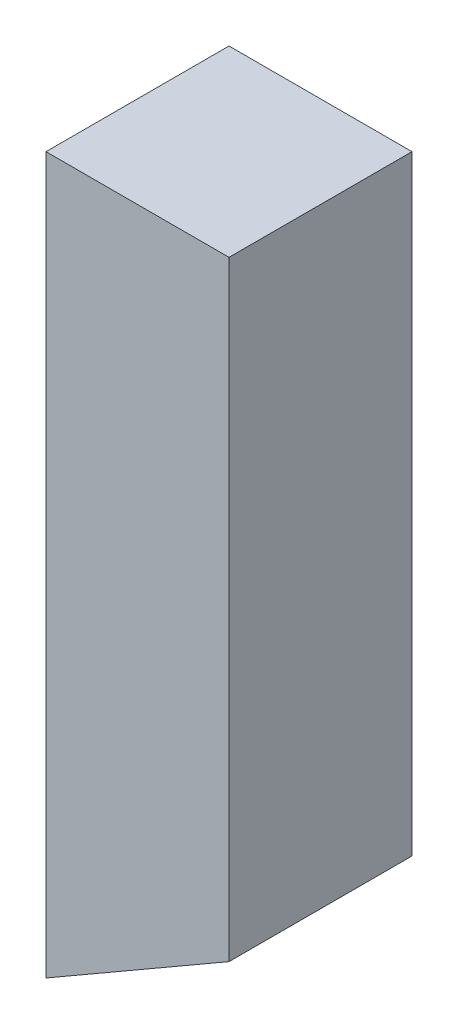
ISO-10303-21;
HEADER;
FILE_DESCRIPTION(('STEP AP214'),'2;1');
FILE_NAME('part.step','',(''),(''),'','','');
FILE_SCHEMA(('AUTOMOTIVE_DESIGN { 1 0 10303 214 1 1 1 1 }'));
ENDSEC;
DATA;
#1=APPLICATION_CONTEXT('core data for automotive mechanical design processes');
#2=APPLICATION_PROTOCOL_DEFINITION('international standard','automotive_design',2000,#1);
#3=PRODUCT_CONTEXT('',#1,'mechanical');
#4=PRODUCT('Part','Part','',(#3));
#5=PRODUCT_RELATED_PRODUCT_CATEGORY('part','',(#4));
#6=PRODUCT_DEFINITION_FORMATION('','',#4);
#7=PRODUCT_DEFINITION_CONTEXT('part definition',#1,'design');
#8=PRODUCT_DEFINITION('design','',#6,#7);
#9=PRODUCT_DEFINITION_SHAPE('','',#8);
#10=(LENGTH_UNIT() NAMED_UNIT(*) SI_UNIT(.MILLI.,.METRE.));
#11=(NAMED_UNIT(*) PLANE_ANGLE_UNIT() SI_UNIT($,.RADIAN.));
#12=(NAMED_UNIT(*) SI_UNIT($,.STERADIAN.) SOLID_ANGLE_UNIT());
#13=UNCERTAINTY_MEASURE_WITH_UNIT(LENGTH_MEASURE(1.E-05),#10,'distance_accuracy_value','');
#14=(GEOMETRIC_REPRESENTATION_CONTEXT(3) GLOBAL_UNCERTAINTY_ASSIGNED_CONTEXT((#13)) GLOBAL_UNIT_ASSIGNED_CONTEXT((#10,
#11,#12)) REPRESENTATION_CONTEXT('',''));
#15=CARTESIAN_POINT('',(0.,0.,0.));
#16=DIRECTION('',(0.,0.,1.));
#17=DIRECTION('',(1.,0.,0.));
#18=AXIS2_PLACEMENT_3D('',#15,#16,#17);
#19=CARTESIAN_POINT('',(0.,0.,60.));
#20=DIRECTION('',(1.,0.,0.));
#21=DIRECTION('',(0.,0.,-1.));
#22=AXIS2_PLACEMENT_3D('',#19,#20,#21);
#23=PLANE('',#22);
#24=DIRECTION('',(0.,-1.,0.));
#25=VECTOR('',#24,1.);
#26=CARTESIAN_POINT('',(0.,0.,0.));
#27=LINE('',#26,#25);
#28=CARTESIAN_POINT('',(0.,200.,0.));
#29=VERTEX_POINT('',#28);
#30=CARTESIAN_POINT('',(0.,-34.6410161513771,0.));
#31=VERTEX_POINT('',#30);
#32=EDGE_CURVE('E79',#29,#31,#27,.T.);
#33=ORIENTED_EDGE('',*,*,#32,.T.);
#34=DIRECTION('',(0.,0.,1.));
#35=VECTOR('',#34,1.);
#36=CARTESIAN_POINT('',(0.,-34.6410161513771,0.));
#37=LINE('',#36,#35);
#38=CARTESIAN_POINT('',(0.,-34.6410161513771,60.));
#39=VERTEX_POINT('',#38);
#40=EDGE_CURVE('E82',#31,#39,#37,.T.);
#41=ORIENTED_EDGE('',*,*,#40,.T.);
#42=DIRECTION('',(0.,-1.,0.));
#43=VECTOR('',#42,1.);
#44=CARTESIAN_POINT('',(0.,0.,60.));
#45=LINE('',#44,#43);
#46=CARTESIAN_POINT('',(0.,200.,60.));
#47=VERTEX_POINT('',#46);
#48=EDGE_CURVE('E99',#47,#39,#45,.T.);
#49=ORIENTED_EDGE('',*,*,#48,.F.);
#50=DIRECTION('',(0.,0.,-1.));
#51=VECTOR('',#50,1.);
#52=CARTESIAN_POINT('',(0.,200.,60.));
#53=LINE('',#52,#51);
#54=EDGE_CURVE('E84',#47,#29,#53,.T.);
#55=ORIENTED_EDGE('',*,*,#54,.T.);
#56=EDGE_LOOP('',(#33,#41,#49,#55));
#57=FACE_BOUND('',#56,.T.);
#58=ADVANCED_FACE('F33',(#57),#23,.F.);
#59=CARTESIAN_POINT('',(60.,0.,60.));
#60=DIRECTION('',(-1.,0.,0.));
#61=DIRECTION('',(0.,0.,1.));
#62=AXIS2_PLACEMENT_3D('',#59,#60,#61);
#63=PLANE('',#62);
#64=DIRECTION('',(0.,1.,0.));
#65=VECTOR('',#64,1.);
#66=CARTESIAN_POINT('',(60.,0.,0.));
#67=LINE('',#66,#65);
#68=CARTESIAN_POINT('',(60.,0.,0.));
#69=VERTEX_POINT('',#68);
#70=CARTESIAN_POINT('',(60.,200.,0.));
#71=VERTEX_POINT('',#70);
#72=EDGE_CURVE('E62',#69,#71,#67,.T.);
#73=ORIENTED_EDGE('',*,*,#72,.T.);
#74=DIRECTION('',(0.,0.,-1.));
#75=VECTOR('',#74,1.);
#76=CARTESIAN_POINT('',(60.,200.,60.));
#77=LINE('',#76,#75);
#78=CARTESIAN_POINT('',(60.,200.,60.));
#79=VERTEX_POINT('',#78);
#80=EDGE_CURVE('E41',#79,#71,#77,.T.);
#81=ORIENTED_EDGE('',*,*,#80,.F.);
#82=DIRECTION('',(0.,1.,0.));
#83=VECTOR('',#82,1.);
#84=CARTESIAN_POINT('',(60.,0.,60.));
#85=LINE('',#84,#83);
#86=CARTESIAN_POINT('',(60.,0.,60.));
#87=VERTEX_POINT('',#86);
#88=EDGE_CURVE('E70',#87,#79,#85,.T.);
#89=ORIENTED_EDGE('',*,*,#88,.F.);
#90=DIRECTION('',(0.,0.,-1.));
#91=VECTOR('',#90,1.);
#92=CARTESIAN_POINT('',(60.,0.,60.));
#93=LINE('',#92,#91);
#94=EDGE_CURVE('E11',#87,#69,#93,.T.);
#95=ORIENTED_EDGE('',*,*,#94,.T.);
#96=EDGE_LOOP('',(#73,#81,#89,#95));
#97=FACE_BOUND('',#96,.T.);
#98=ADVANCED_FACE('F106',(#97),#63,.F.);
#99=CARTESIAN_POINT('',(0.,200.,60.));
#100=DIRECTION('',(0.,-1.,0.));
#101=DIRECTION('',(0.,0.,-1.));
#102=AXIS2_PLACEMENT_3D('',#99,#100,#101);
#103=PLANE('',#102);
#104=DIRECTION('',(-1.,0.,0.));
#105=VECTOR('',#104,1.);
#106=CARTESIAN_POINT('',(0.,200.,0.));
#107=LINE('',#106,#105);
#108=EDGE_CURVE('E67',#71,#29,#107,.T.);
#109=ORIENTED_EDGE('',*,*,#108,.T.);
#110=ORIENTED_EDGE('',*,*,#54,.F.);
#111=DIRECTION('',(-1.,0.,0.));
#112=VECTOR('',#111,1.);
#113=CARTESIAN_POINT('',(0.,200.,60.));
#114=LINE('',#113,#112);
#115=EDGE_CURVE('E49',#79,#47,#114,.T.);
#116=ORIENTED_EDGE('',*,*,#115,.F.);
#117=ORIENTED_EDGE('',*,*,#80,.T.);
#118=EDGE_LOOP('',(#109,#110,#116,#117));
#119=FACE_BOUND('',#118,.T.);
#120=ADVANCED_FACE('F105',(#119),#103,.F.);
#121=CARTESIAN_POINT('',(0.,0.,60.));
#122=DIRECTION('',(0.,0.,-1.));
#123=DIRECTION('',(-1.,0.,0.));
#124=AXIS2_PLACEMENT_3D('',#121,#122,#123);
#125=PLANE('',#124);
#126=ORIENTED_EDGE('',*,*,#48,.T.);
#127=DIRECTION('',(0.866025403784441,0.499999999999995,0.));
#128=VECTOR('',#127,1.);
#129=CARTESIAN_POINT('',(0.,-34.6410161513771,60.));
#130=LINE('',#129,#128);
#131=EDGE_CURVE('E93',#39,#87,#130,.T.);
#132=ORIENTED_EDGE('',*,*,#131,.T.);
#133=ORIENTED_EDGE('',*,*,#88,.T.);
#134=ORIENTED_EDGE('',*,*,#115,.T.);
#135=EDGE_LOOP('',(#126,#132,#133,#134));
#136=FACE_BOUND('',#135,.T.);
#137=ADVANCED_FACE('F112',(#136),#125,.F.);
#138=CARTESIAN_POINT('',(0.,0.,0.));
#139=DIRECTION('',(0.,0.,-1.));
#140=DIRECTION('',(-1.,0.,0.));
#141=AXIS2_PLACEMENT_3D('',#138,#139,#140);
#142=PLANE('',#141);
#143=ORIENTED_EDGE('',*,*,#32,.F.);
#144=ORIENTED_EDGE('',*,*,#108,.F.);
#145=ORIENTED_EDGE('',*,*,#72,.F.);
#146=DIRECTION('',(0.866025403784441,0.499999999999995,0.));
#147=VECTOR('',#146,1.);
#148=CARTESIAN_POINT('',(0.,-34.6410161513771,0.));
#149=LINE('',#148,#147);
#150=EDGE_CURVE('E91',#31,#69,#149,.T.);
#151=ORIENTED_EDGE('',*,*,#150,.F.);
#152=EDGE_LOOP('',(#143,#144,#145,#151));
#153=FACE_BOUND('',#152,.T.);
#154=ADVANCED_FACE('F95',(#153),#142,.T.);
#155=CARTESIAN_POINT('',(0.,-34.6410161513771,0.));
#156=DIRECTION('',(0.499999999999995,-0.866025403784441,0.));
#157=DIRECTION('',(0.866025403784441,0.499999999999995,0.));
#158=AXIS2_PLACEMENT_3D('',#155,#156,#157);
#159=PLANE('',#158);
#160=ORIENTED_EDGE('',*,*,#131,.F.);
#161=ORIENTED_EDGE('',*,*,#40,.F.);
#162=ORIENTED_EDGE('',*,*,#150,.T.);
#163=ORIENTED_EDGE('',*,*,#94,.F.);
#164=EDGE_LOOP('',(#160,#161,#162,#163));
#165=FACE_BOUND('',#164,.T.);
#166=ADVANCED_FACE('F90',(#165),#159,.T.);
#167=CLOSED_SHELL('',(#58,#98,#120,#137,#154,#166));
#168=MANIFOLD_SOLID_BREP('B2',#167);
#169=ADVANCED_BREP_SHAPE_REPRESENTATION('',(#18,#168),#14);
#170=SHAPE_DEFINITION_REPRESENTATION(#9,#169);
ENDSEC;
END-ISO-10303-21;
